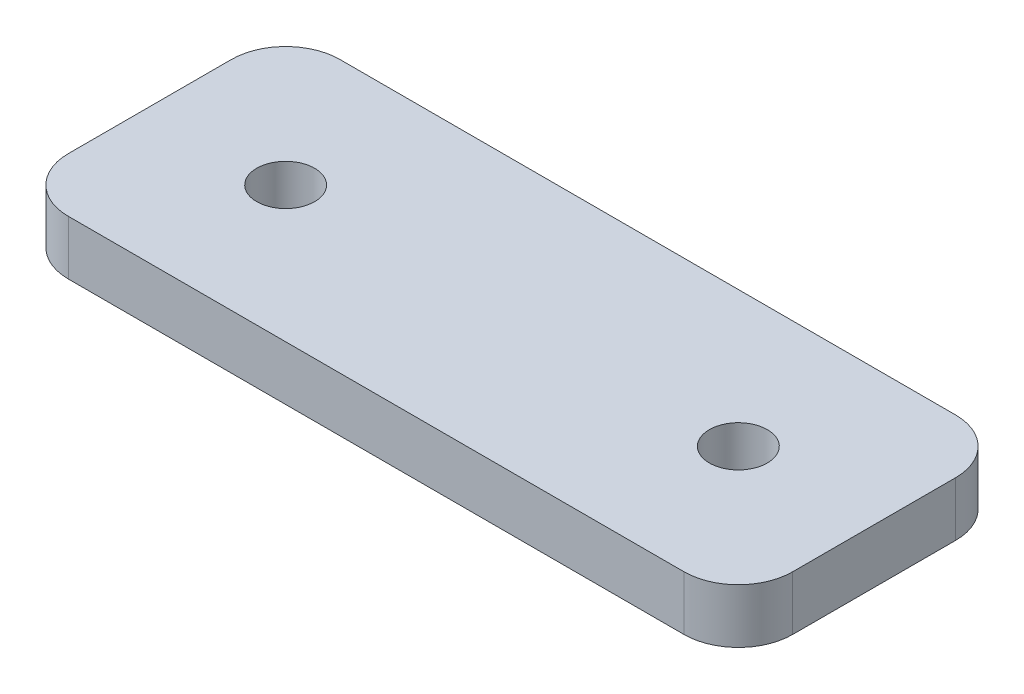
ISO-10303-21;
HEADER;
FILE_DESCRIPTION(('STEP AP214'),'2;1');
FILE_NAME('part.step','',(''),(''),'','','');
FILE_SCHEMA(('AUTOMOTIVE_DESIGN { 1 0 10303 214 1 1 1 1 }'));
ENDSEC;
DATA;
#1=APPLICATION_CONTEXT('core data for automotive mechanical design processes');
#2=APPLICATION_PROTOCOL_DEFINITION('international standard','automotive_design',2000,#1);
#3=PRODUCT_CONTEXT('',#1,'mechanical');
#4=PRODUCT('Part','Part','',(#3));
#5=PRODUCT_RELATED_PRODUCT_CATEGORY('part','',(#4));
#6=PRODUCT_DEFINITION_FORMATION('','',#4);
#7=PRODUCT_DEFINITION_CONTEXT('part definition',#1,'design');
#8=PRODUCT_DEFINITION('design','',#6,#7);
#9=PRODUCT_DEFINITION_SHAPE('','',#8);
#10=(LENGTH_UNIT() NAMED_UNIT(*) SI_UNIT(.MILLI.,.METRE.));
#11=(NAMED_UNIT(*) PLANE_ANGLE_UNIT() SI_UNIT($,.RADIAN.));
#12=(NAMED_UNIT(*) SI_UNIT($,.STERADIAN.) SOLID_ANGLE_UNIT());
#13=UNCERTAINTY_MEASURE_WITH_UNIT(LENGTH_MEASURE(1.E-05),#10,'distance_accuracy_value','');
#14=(GEOMETRIC_REPRESENTATION_CONTEXT(3) GLOBAL_UNCERTAINTY_ASSIGNED_CONTEXT((#13)) GLOBAL_UNIT_ASSIGNED_CONTEXT((#10,
#11,#12)) REPRESENTATION_CONTEXT('',''));
#15=CARTESIAN_POINT('',(0.,0.,0.));
#16=DIRECTION('',(0.,0.,1.));
#17=DIRECTION('',(1.,0.,0.));
#18=AXIS2_PLACEMENT_3D('',#15,#16,#17);
#19=CARTESIAN_POINT('',(0.,3.,0.));
#20=DIRECTION('',(0.,-1.,0.));
#21=DIRECTION('',(0.,0.,-1.));
#22=AXIS2_PLACEMENT_3D('',#19,#20,#21);
#23=PLANE('',#22);
#24=DIRECTION('',(0.,0.,1.));
#25=VECTOR('',#24,1.);
#26=CARTESIAN_POINT('',(-20.,3.,7.5));
#27=LINE('',#26,#25);
#28=CARTESIAN_POINT('',(-20.,3.,-4.5));
#29=VERTEX_POINT('',#28);
#30=CARTESIAN_POINT('',(-20.,3.,4.5));
#31=VERTEX_POINT('',#30);
#32=EDGE_CURVE('E179',#29,#31,#27,.T.);
#33=ORIENTED_EDGE('',*,*,#32,.T.);
#34=CARTESIAN_POINT('',(-17.,3.,4.5));
#35=DIRECTION('',(0.,-1.,0.));
#36=DIRECTION('',(0.,0.,-1.));
#37=AXIS2_PLACEMENT_3D('',#34,#35,#36);
#38=CIRCLE('',#37,3.);
#39=CARTESIAN_POINT('',(-17.,3.,7.5));
#40=VERTEX_POINT('',#39);
#41=EDGE_CURVE('E156',#31,#40,#38,.F.);
#42=ORIENTED_EDGE('',*,*,#41,.T.);
#43=DIRECTION('',(1.,0.,0.));
#44=VECTOR('',#43,1.);
#45=CARTESIAN_POINT('',(-20.,3.,7.5));
#46=LINE('',#45,#44);
#47=CARTESIAN_POINT('',(17.,3.,7.5));
#48=VERTEX_POINT('',#47);
#49=EDGE_CURVE('E127',#40,#48,#46,.T.);
#50=ORIENTED_EDGE('',*,*,#49,.T.);
#51=CARTESIAN_POINT('',(17.,3.,4.5));
#52=DIRECTION('',(0.,-1.,0.));
#53=DIRECTION('',(0.,0.,-1.));
#54=AXIS2_PLACEMENT_3D('',#51,#52,#53);
#55=CIRCLE('',#54,3.);
#56=CARTESIAN_POINT('',(20.,3.,4.5));
#57=VERTEX_POINT('',#56);
#58=EDGE_CURVE('E151',#48,#57,#55,.F.);
#59=ORIENTED_EDGE('',*,*,#58,.T.);
#60=DIRECTION('',(0.,0.,-1.));
#61=VECTOR('',#60,1.);
#62=CARTESIAN_POINT('',(20.,3.,7.5));
#63=LINE('',#62,#61);
#64=CARTESIAN_POINT('',(20.,3.,-4.5));
#65=VERTEX_POINT('',#64);
#66=EDGE_CURVE('E134',#57,#65,#63,.T.);
#67=ORIENTED_EDGE('',*,*,#66,.T.);
#68=CARTESIAN_POINT('',(17.,3.,-4.5));
#69=DIRECTION('',(0.,-1.,0.));
#70=DIRECTION('',(0.,0.,-1.));
#71=AXIS2_PLACEMENT_3D('',#68,#69,#70);
#72=CIRCLE('',#71,3.);
#73=CARTESIAN_POINT('',(17.,3.,-7.5));
#74=VERTEX_POINT('',#73);
#75=EDGE_CURVE('E63',#65,#74,#72,.F.);
#76=ORIENTED_EDGE('',*,*,#75,.T.);
#77=DIRECTION('',(-1.,0.,0.));
#78=VECTOR('',#77,1.);
#79=CARTESIAN_POINT('',(-20.,3.,-7.5));
#80=LINE('',#79,#78);
#81=CARTESIAN_POINT('',(-17.,3.,-7.5));
#82=VERTEX_POINT('',#81);
#83=EDGE_CURVE('E137',#74,#82,#80,.T.);
#84=ORIENTED_EDGE('',*,*,#83,.T.);
#85=CARTESIAN_POINT('',(-17.,3.,-4.5));
#86=DIRECTION('',(0.,-1.,0.));
#87=DIRECTION('',(0.,0.,-1.));
#88=AXIS2_PLACEMENT_3D('',#85,#86,#87);
#89=CIRCLE('',#88,3.);
#90=EDGE_CURVE('E154',#82,#29,#89,.F.);
#91=ORIENTED_EDGE('',*,*,#90,.T.);
#92=EDGE_LOOP('',(#33,#42,#50,#59,#67,#76,#84,#91));
#93=FACE_BOUND('',#92,.T.);
#94=CARTESIAN_POINT('',(-12.5,3.,0.));
#95=DIRECTION('',(0.,1.,0.));
#96=DIRECTION('',(0.,0.,1.));
#97=AXIS2_PLACEMENT_3D('',#94,#95,#96);
#98=CIRCLE('',#97,1.6);
#99=CARTESIAN_POINT('',(-12.5,3.,1.6));
#100=VERTEX_POINT('',#99);
#101=EDGE_CURVE('E172',#100,#100,#98,.T.);
#102=ORIENTED_EDGE('',*,*,#101,.F.);
#103=EDGE_LOOP('',(#102));
#104=FACE_BOUND('',#103,.T.);
#105=CARTESIAN_POINT('',(12.5,3.,0.));
#106=DIRECTION('',(0.,1.,0.));
#107=DIRECTION('',(0.,0.,-1.));
#108=AXIS2_PLACEMENT_3D('',#105,#106,#107);
#109=CIRCLE('',#108,1.6);
#110=CARTESIAN_POINT('',(12.5,3.,-1.6));
#111=VERTEX_POINT('',#110);
#112=EDGE_CURVE('E184',#111,#111,#109,.T.);
#113=ORIENTED_EDGE('',*,*,#112,.F.);
#114=EDGE_LOOP('',(#113));
#115=FACE_BOUND('',#114,.T.);
#116=ADVANCED_FACE('F41',(#93,#104,#115),#23,.F.);
#117=CARTESIAN_POINT('',(0.,0.,0.));
#118=DIRECTION('',(0.,-1.,0.));
#119=DIRECTION('',(0.,0.,-1.));
#120=AXIS2_PLACEMENT_3D('',#117,#118,#119);
#121=PLANE('',#120);
#122=CARTESIAN_POINT('',(-12.5,0.,0.));
#123=DIRECTION('',(0.,1.,0.));
#124=DIRECTION('',(0.,0.,1.));
#125=AXIS2_PLACEMENT_3D('',#122,#123,#124);
#126=CIRCLE('',#125,1.6);
#127=CARTESIAN_POINT('',(-12.5,0.,1.6));
#128=VERTEX_POINT('',#127);
#129=EDGE_CURVE('E175',#128,#128,#126,.T.);
#130=ORIENTED_EDGE('',*,*,#129,.T.);
#131=EDGE_LOOP('',(#130));
#132=FACE_BOUND('',#131,.T.);
#133=DIRECTION('',(1.,0.,0.));
#134=VECTOR('',#133,1.);
#135=CARTESIAN_POINT('',(-20.,0.,7.5));
#136=LINE('',#135,#134);
#137=CARTESIAN_POINT('',(-17.,0.,7.5));
#138=VERTEX_POINT('',#137);
#139=CARTESIAN_POINT('',(17.,0.,7.5));
#140=VERTEX_POINT('',#139);
#141=EDGE_CURVE('E124',#138,#140,#136,.T.);
#142=ORIENTED_EDGE('',*,*,#141,.F.);
#143=CARTESIAN_POINT('',(-17.,0.,4.5));
#144=DIRECTION('',(0.,-1.,0.));
#145=DIRECTION('',(0.,0.,-1.));
#146=AXIS2_PLACEMENT_3D('',#143,#144,#145);
#147=CIRCLE('',#146,3.);
#148=CARTESIAN_POINT('',(-20.,0.,4.5));
#149=VERTEX_POINT('',#148);
#150=EDGE_CURVE('E107',#138,#149,#147,.T.);
#151=ORIENTED_EDGE('',*,*,#150,.T.);
#152=DIRECTION('',(0.,0.,1.));
#153=VECTOR('',#152,1.);
#154=CARTESIAN_POINT('',(-20.,0.,7.5));
#155=LINE('',#154,#153);
#156=CARTESIAN_POINT('',(-20.,0.,-4.5));
#157=VERTEX_POINT('',#156);
#158=EDGE_CURVE('E135',#157,#149,#155,.T.);
#159=ORIENTED_EDGE('',*,*,#158,.F.);
#160=CARTESIAN_POINT('',(-17.,0.,-4.5));
#161=DIRECTION('',(0.,-1.,0.));
#162=DIRECTION('',(0.,0.,-1.));
#163=AXIS2_PLACEMENT_3D('',#160,#161,#162);
#164=CIRCLE('',#163,3.);
#165=CARTESIAN_POINT('',(-17.,0.,-7.5));
#166=VERTEX_POINT('',#165);
#167=EDGE_CURVE('E118',#157,#166,#164,.T.);
#168=ORIENTED_EDGE('',*,*,#167,.T.);
#169=DIRECTION('',(-1.,0.,0.));
#170=VECTOR('',#169,1.);
#171=CARTESIAN_POINT('',(-20.,0.,-7.5));
#172=LINE('',#171,#170);
#173=CARTESIAN_POINT('',(17.,0.,-7.5));
#174=VERTEX_POINT('',#173);
#175=EDGE_CURVE('E139',#174,#166,#172,.T.);
#176=ORIENTED_EDGE('',*,*,#175,.F.);
#177=CARTESIAN_POINT('',(17.,0.,-4.5));
#178=DIRECTION('',(0.,-1.,0.));
#179=DIRECTION('',(0.,0.,-1.));
#180=AXIS2_PLACEMENT_3D('',#177,#178,#179);
#181=CIRCLE('',#180,3.);
#182=CARTESIAN_POINT('',(20.,0.,-4.5));
#183=VERTEX_POINT('',#182);
#184=EDGE_CURVE('E145',#174,#183,#181,.T.);
#185=ORIENTED_EDGE('',*,*,#184,.T.);
#186=DIRECTION('',(0.,0.,-1.));
#187=VECTOR('',#186,1.);
#188=CARTESIAN_POINT('',(20.,0.,7.5));
#189=LINE('',#188,#187);
#190=CARTESIAN_POINT('',(20.,0.,4.5));
#191=VERTEX_POINT('',#190);
#192=EDGE_CURVE('E167',#191,#183,#189,.T.);
#193=ORIENTED_EDGE('',*,*,#192,.F.);
#194=CARTESIAN_POINT('',(17.,0.,4.5));
#195=DIRECTION('',(0.,-1.,0.));
#196=DIRECTION('',(0.,0.,-1.));
#197=AXIS2_PLACEMENT_3D('',#194,#195,#196);
#198=CIRCLE('',#197,3.);
#199=EDGE_CURVE('E128',#191,#140,#198,.T.);
#200=ORIENTED_EDGE('',*,*,#199,.T.);
#201=EDGE_LOOP('',(#142,#151,#159,#168,#176,#185,#193,#200));
#202=FACE_BOUND('',#201,.T.);
#203=CARTESIAN_POINT('',(12.5,0.,0.));
#204=DIRECTION('',(0.,1.,0.));
#205=DIRECTION('',(0.,0.,-1.));
#206=AXIS2_PLACEMENT_3D('',#203,#204,#205);
#207=CIRCLE('',#206,1.6);
#208=CARTESIAN_POINT('',(12.5,0.,-1.6));
#209=VERTEX_POINT('',#208);
#210=EDGE_CURVE('E186',#209,#209,#207,.T.);
#211=ORIENTED_EDGE('',*,*,#210,.T.);
#212=EDGE_LOOP('',(#211));
#213=FACE_BOUND('',#212,.T.);
#214=ADVANCED_FACE('F131',(#132,#202,#213),#121,.T.);
#215=CARTESIAN_POINT('',(20.,3.,7.5));
#216=DIRECTION('',(-1.,0.,0.));
#217=DIRECTION('',(0.,0.,1.));
#218=AXIS2_PLACEMENT_3D('',#215,#216,#217);
#219=PLANE('',#218);
#220=ORIENTED_EDGE('',*,*,#192,.T.);
#221=DIRECTION('',(0.,-1.,0.));
#222=VECTOR('',#221,1.);
#223=CARTESIAN_POINT('',(20.,3.,-4.5));
#224=LINE('',#223,#222);
#225=EDGE_CURVE('E11',#183,#65,#224,.F.);
#226=ORIENTED_EDGE('',*,*,#225,.T.);
#227=ORIENTED_EDGE('',*,*,#66,.F.);
#228=DIRECTION('',(0.,-1.,0.));
#229=VECTOR('',#228,1.);
#230=CARTESIAN_POINT('',(20.,3.,4.5));
#231=LINE('',#230,#229);
#232=EDGE_CURVE('E49',#57,#191,#231,.T.);
#233=ORIENTED_EDGE('',*,*,#232,.T.);
#234=EDGE_LOOP('',(#220,#226,#227,#233));
#235=FACE_BOUND('',#234,.T.);
#236=ADVANCED_FACE('F166',(#235),#219,.F.);
#237=CARTESIAN_POINT('',(-20.,3.,-7.5));
#238=DIRECTION('',(0.,0.,1.));
#239=DIRECTION('',(1.,0.,0.));
#240=AXIS2_PLACEMENT_3D('',#237,#238,#239);
#241=PLANE('',#240);
#242=ORIENTED_EDGE('',*,*,#175,.T.);
#243=DIRECTION('',(0.,-1.,0.));
#244=VECTOR('',#243,1.);
#245=CARTESIAN_POINT('',(-17.,3.,-7.5));
#246=LINE('',#245,#244);
#247=EDGE_CURVE('E56',#166,#82,#246,.F.);
#248=ORIENTED_EDGE('',*,*,#247,.T.);
#249=ORIENTED_EDGE('',*,*,#83,.F.);
#250=DIRECTION('',(0.,-1.,0.));
#251=VECTOR('',#250,1.);
#252=CARTESIAN_POINT('',(17.,3.,-7.5));
#253=LINE('',#252,#251);
#254=EDGE_CURVE('E158',#74,#174,#253,.T.);
#255=ORIENTED_EDGE('',*,*,#254,.T.);
#256=EDGE_LOOP('',(#242,#248,#249,#255));
#257=FACE_BOUND('',#256,.T.);
#258=ADVANCED_FACE('F213',(#257),#241,.F.);
#259=CARTESIAN_POINT('',(-20.,3.,7.5));
#260=DIRECTION('',(1.,0.,0.));
#261=DIRECTION('',(0.,0.,-1.));
#262=AXIS2_PLACEMENT_3D('',#259,#260,#261);
#263=PLANE('',#262);
#264=ORIENTED_EDGE('',*,*,#158,.T.);
#265=DIRECTION('',(0.,-1.,0.));
#266=VECTOR('',#265,1.);
#267=CARTESIAN_POINT('',(-20.,3.,4.5));
#268=LINE('',#267,#266);
#269=EDGE_CURVE('E112',#149,#31,#268,.F.);
#270=ORIENTED_EDGE('',*,*,#269,.T.);
#271=ORIENTED_EDGE('',*,*,#32,.F.);
#272=DIRECTION('',(0.,-1.,0.));
#273=VECTOR('',#272,1.);
#274=CARTESIAN_POINT('',(-20.,3.,-4.5));
#275=LINE('',#274,#273);
#276=EDGE_CURVE('E117',#29,#157,#275,.T.);
#277=ORIENTED_EDGE('',*,*,#276,.T.);
#278=EDGE_LOOP('',(#264,#270,#271,#277));
#279=FACE_BOUND('',#278,.T.);
#280=ADVANCED_FACE('F210',(#279),#263,.F.);
#281=CARTESIAN_POINT('',(-20.,3.,7.5));
#282=DIRECTION('',(0.,0.,-1.));
#283=DIRECTION('',(-1.,0.,0.));
#284=AXIS2_PLACEMENT_3D('',#281,#282,#283);
#285=PLANE('',#284);
#286=ORIENTED_EDGE('',*,*,#49,.F.);
#287=DIRECTION('',(0.,-1.,0.));
#288=VECTOR('',#287,1.);
#289=CARTESIAN_POINT('',(-17.,3.,7.5));
#290=LINE('',#289,#288);
#291=EDGE_CURVE('E111',#40,#138,#290,.T.);
#292=ORIENTED_EDGE('',*,*,#291,.T.);
#293=ORIENTED_EDGE('',*,*,#141,.T.);
#294=DIRECTION('',(0.,-1.,0.));
#295=VECTOR('',#294,1.);
#296=CARTESIAN_POINT('',(17.,3.,7.5));
#297=LINE('',#296,#295);
#298=EDGE_CURVE('E129',#140,#48,#297,.F.);
#299=ORIENTED_EDGE('',*,*,#298,.T.);
#300=EDGE_LOOP('',(#286,#292,#293,#299));
#301=FACE_BOUND('',#300,.T.);
#302=ADVANCED_FACE('F123',(#301),#285,.F.);
#303=CARTESIAN_POINT('',(-12.5,3.,0.));
#304=DIRECTION('',(0.,-1.,0.));
#305=DIRECTION('',(0.,0.,-1.));
#306=AXIS2_PLACEMENT_3D('',#303,#304,#305);
#307=CYLINDRICAL_SURFACE('',#306,1.6);
#308=ORIENTED_EDGE('',*,*,#101,.T.);
#309=EDGE_LOOP('',(#308));
#310=FACE_BOUND('',#309,.T.);
#311=ORIENTED_EDGE('',*,*,#129,.F.);
#312=EDGE_LOOP('',(#311));
#313=FACE_BOUND('',#312,.T.);
#314=ADVANCED_FACE('F205',(#310,#313),#307,.F.);
#315=CARTESIAN_POINT('',(12.5,3.,0.));
#316=DIRECTION('',(0.,-1.,0.));
#317=DIRECTION('',(0.,0.,-1.));
#318=AXIS2_PLACEMENT_3D('',#315,#316,#317);
#319=CYLINDRICAL_SURFACE('',#318,1.6);
#320=ORIENTED_EDGE('',*,*,#112,.T.);
#321=EDGE_LOOP('',(#320));
#322=FACE_BOUND('',#321,.T.);
#323=ORIENTED_EDGE('',*,*,#210,.F.);
#324=EDGE_LOOP('',(#323));
#325=FACE_BOUND('',#324,.T.);
#326=ADVANCED_FACE('F192',(#322,#325),#319,.F.);
#327=CARTESIAN_POINT('',(-17.,3.,4.5));
#328=DIRECTION('',(0.,-1.,0.));
#329=DIRECTION('',(0.,0.,-1.));
#330=AXIS2_PLACEMENT_3D('',#327,#328,#329);
#331=CYLINDRICAL_SURFACE('',#330,3.);
#332=ORIENTED_EDGE('',*,*,#41,.F.);
#333=ORIENTED_EDGE('',*,*,#269,.F.);
#334=ORIENTED_EDGE('',*,*,#150,.F.);
#335=ORIENTED_EDGE('',*,*,#291,.F.);
#336=EDGE_LOOP('',(#332,#333,#334,#335));
#337=FACE_BOUND('',#336,.T.);
#338=ADVANCED_FACE('F110',(#337),#331,.T.);
#339=CARTESIAN_POINT('',(-17.,3.,-4.5));
#340=DIRECTION('',(0.,-1.,0.));
#341=DIRECTION('',(0.,0.,-1.));
#342=AXIS2_PLACEMENT_3D('',#339,#340,#341);
#343=CYLINDRICAL_SURFACE('',#342,3.);
#344=ORIENTED_EDGE('',*,*,#90,.F.);
#345=ORIENTED_EDGE('',*,*,#247,.F.);
#346=ORIENTED_EDGE('',*,*,#167,.F.);
#347=ORIENTED_EDGE('',*,*,#276,.F.);
#348=EDGE_LOOP('',(#344,#345,#346,#347));
#349=FACE_BOUND('',#348,.T.);
#350=ADVANCED_FACE('F221',(#349),#343,.T.);
#351=CARTESIAN_POINT('',(17.,3.,-4.5));
#352=DIRECTION('',(0.,-1.,0.));
#353=DIRECTION('',(0.,0.,-1.));
#354=AXIS2_PLACEMENT_3D('',#351,#352,#353);
#355=CYLINDRICAL_SURFACE('',#354,3.);
#356=ORIENTED_EDGE('',*,*,#75,.F.);
#357=ORIENTED_EDGE('',*,*,#225,.F.);
#358=ORIENTED_EDGE('',*,*,#184,.F.);
#359=ORIENTED_EDGE('',*,*,#254,.F.);
#360=EDGE_LOOP('',(#356,#357,#358,#359));
#361=FACE_BOUND('',#360,.T.);
#362=ADVANCED_FACE('F223',(#361),#355,.T.);
#363=CARTESIAN_POINT('',(17.,3.,4.5));
#364=DIRECTION('',(0.,-1.,0.));
#365=DIRECTION('',(0.,0.,-1.));
#366=AXIS2_PLACEMENT_3D('',#363,#364,#365);
#367=CYLINDRICAL_SURFACE('',#366,3.);
#368=ORIENTED_EDGE('',*,*,#58,.F.);
#369=ORIENTED_EDGE('',*,*,#298,.F.);
#370=ORIENTED_EDGE('',*,*,#199,.F.);
#371=ORIENTED_EDGE('',*,*,#232,.F.);
#372=EDGE_LOOP('',(#368,#369,#370,#371));
#373=FACE_BOUND('',#372,.T.);
#374=ADVANCED_FACE('F43',(#373),#367,.T.);
#375=CLOSED_SHELL('',(#116,#214,#236,#258,#280,#302,#314,#326,#338,#350,#362,#374));
#376=MANIFOLD_SOLID_BREP('B2',#375);
#377=ADVANCED_BREP_SHAPE_REPRESENTATION('',(#18,#376),#14);
#378=SHAPE_DEFINITION_REPRESENTATION(#9,#377);
ENDSEC;
END-ISO-10303-21;
